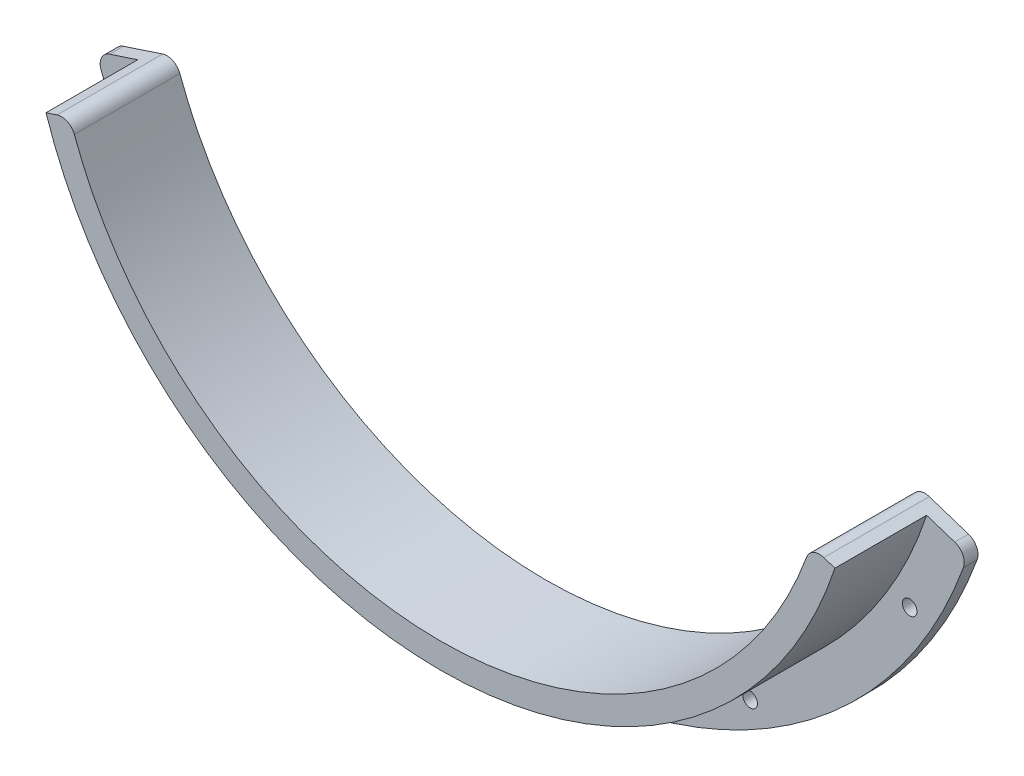
ISO-10303-21;
HEADER;
FILE_DESCRIPTION(('STEP AP214'),'2;1');
FILE_NAME('part.step','',(''),(''),'','','');
FILE_SCHEMA(('AUTOMOTIVE_DESIGN { 1 0 10303 214 1 1 1 1 }'));
ENDSEC;
DATA;
#1=APPLICATION_CONTEXT('core data for automotive mechanical design processes');
#2=APPLICATION_PROTOCOL_DEFINITION('international standard','automotive_design',2000,#1);
#3=PRODUCT_CONTEXT('',#1,'mechanical');
#4=PRODUCT('Part','Part','',(#3));
#5=PRODUCT_RELATED_PRODUCT_CATEGORY('part','',(#4));
#6=PRODUCT_DEFINITION_FORMATION('','',#4);
#7=PRODUCT_DEFINITION_CONTEXT('part definition',#1,'design');
#8=PRODUCT_DEFINITION('design','',#6,#7);
#9=PRODUCT_DEFINITION_SHAPE('','',#8);
#10=(LENGTH_UNIT() NAMED_UNIT(*) SI_UNIT(.MILLI.,.METRE.));
#11=(NAMED_UNIT(*) PLANE_ANGLE_UNIT() SI_UNIT($,.RADIAN.));
#12=(NAMED_UNIT(*) SI_UNIT($,.STERADIAN.) SOLID_ANGLE_UNIT());
#13=UNCERTAINTY_MEASURE_WITH_UNIT(LENGTH_MEASURE(1.E-05),#10,'distance_accuracy_value','');
#14=(GEOMETRIC_REPRESENTATION_CONTEXT(3) GLOBAL_UNCERTAINTY_ASSIGNED_CONTEXT((#13)) GLOBAL_UNIT_ASSIGNED_CONTEXT((#10,
#11,#12)) REPRESENTATION_CONTEXT('',''));
#15=CARTESIAN_POINT('',(0.,0.,0.));
#16=DIRECTION('',(0.,0.,1.));
#17=DIRECTION('',(1.,0.,0.));
#18=AXIS2_PLACEMENT_3D('',#15,#16,#17);
#19=CARTESIAN_POINT('',(0.,0.,3.));
#20=DIRECTION('',(0.,0.,-1.));
#21=DIRECTION('',(-1.,0.,0.));
#22=AXIS2_PLACEMENT_3D('',#19,#20,#21);
#23=CYLINDRICAL_SURFACE('',#22,85.);
#24=CARTESIAN_POINT('',(0.,0.,23.));
#25=DIRECTION('',(0.,0.,1.));
#26=DIRECTION('',(1.,0.,0.));
#27=AXIS2_PLACEMENT_3D('',#24,#25,#26);
#28=CIRCLE('',#27,85.);
#29=CARTESIAN_POINT('',(79.7982478830999,-29.278654934736,23.));
#30=VERTEX_POINT('',#29);
#31=CARTESIAN_POINT('',(-79.7982478830924,-29.2786549347566,23.));
#32=VERTEX_POINT('',#31);
#33=EDGE_CURVE('E142',#30,#32,#28,.F.);
#34=ORIENTED_EDGE('',*,*,#33,.F.);
#35=DIRECTION('',(0.,0.,-1.));
#36=VECTOR('',#35,1.);
#37=CARTESIAN_POINT('',(79.7982478830999,-29.278654934736,3.));
#38=LINE('',#37,#36);
#39=CARTESIAN_POINT('',(79.7982478830999,-29.278654934736,0.));
#40=VERTEX_POINT('',#39);
#41=EDGE_CURVE('E214',#30,#40,#38,.T.);
#42=ORIENTED_EDGE('',*,*,#41,.T.);
#43=CARTESIAN_POINT('',(0.,0.,0.));
#44=DIRECTION('',(0.,0.,1.));
#45=DIRECTION('',(1.,0.,0.));
#46=AXIS2_PLACEMENT_3D('',#43,#44,#45);
#47=CIRCLE('',#46,85.);
#48=CARTESIAN_POINT('',(-79.7982478830924,-29.2786549347566,0.));
#49=VERTEX_POINT('',#48);
#50=EDGE_CURVE('E137',#49,#40,#47,.T.);
#51=ORIENTED_EDGE('',*,*,#50,.F.);
#52=DIRECTION('',(0.,0.,-1.));
#53=VECTOR('',#52,1.);
#54=CARTESIAN_POINT('',(-79.7982478830924,-29.2786549347566,3.));
#55=LINE('',#54,#53);
#56=EDGE_CURVE('E59',#49,#32,#55,.F.);
#57=ORIENTED_EDGE('',*,*,#56,.T.);
#58=EDGE_LOOP('',(#34,#42,#51,#57));
#59=FACE_BOUND('',#58,.T.);
#60=ADVANCED_FACE('F36',(#59),#23,.F.);
#61=CARTESIAN_POINT('',(0.,0.,3.));
#62=DIRECTION('',(0.312249899920042,-0.94999999999996,0.));
#63=DIRECTION('',(0.94999999999996,0.312249899920042,0.));
#64=AXIS2_PLACEMENT_3D('',#61,#62,#63);
#65=PLANE('',#64);
#66=DIRECTION('',(-0.94999999999996,-0.312249899920042,0.));
#67=VECTOR('',#66,1.);
#68=CARTESIAN_POINT('',(0.,0.,23.));
#69=LINE('',#68,#67);
#70=CARTESIAN_POINT('',(-83.5514063316675,-27.4620192265716,23.));
#71=VERTEX_POINT('',#70);
#72=CARTESIAN_POINT('',(-85.9749999999964,-28.2586159427638,23.));
#73=VERTEX_POINT('',#72);
#74=EDGE_CURVE('E112',#71,#73,#69,.T.);
#75=ORIENTED_EDGE('',*,*,#74,.F.);
#76=DIRECTION('',(0.,0.,1.));
#77=VECTOR('',#76,1.);
#78=CARTESIAN_POINT('',(-83.5514063316675,-27.4620192265716,0.));
#79=LINE('',#78,#77);
#80=CARTESIAN_POINT('',(-83.5514063316675,-27.4620192265716,0.));
#81=VERTEX_POINT('',#80);
#82=EDGE_CURVE('E11',#71,#81,#79,.F.);
#83=ORIENTED_EDGE('',*,*,#82,.T.);
#84=DIRECTION('',(-0.94999999999996,-0.312249899920042,0.));
#85=VECTOR('',#84,1.);
#86=CARTESIAN_POINT('',(0.,0.,0.));
#87=LINE('',#86,#85);
#88=CARTESIAN_POINT('',(-92.1059172909063,-30.2737510064531,0.));
#89=VERTEX_POINT('',#88);
#90=EDGE_CURVE('E140',#81,#89,#87,.T.);
#91=ORIENTED_EDGE('',*,*,#90,.T.);
#92=DIRECTION('',(0.,0.,-1.));
#93=VECTOR('',#92,1.);
#94=CARTESIAN_POINT('',(-92.1059172909063,-30.2737510064531,3.));
#95=LINE('',#94,#93);
#96=CARTESIAN_POINT('',(-92.1059172909063,-30.2737510064531,3.));
#97=VERTEX_POINT('',#96);
#98=EDGE_CURVE('E44',#89,#97,#95,.F.);
#99=ORIENTED_EDGE('',*,*,#98,.T.);
#100=DIRECTION('',(-0.94999999999996,-0.312249899920042,0.));
#101=VECTOR('',#100,1.);
#102=CARTESIAN_POINT('',(0.,0.,3.));
#103=LINE('',#102,#101);
#104=CARTESIAN_POINT('',(-85.9749999999964,-28.2586159427638,3.));
#105=VERTEX_POINT('',#104);
#106=EDGE_CURVE('E136',#105,#97,#103,.T.);
#107=ORIENTED_EDGE('',*,*,#106,.F.);
#108=DIRECTION('',(0.,0.,-1.));
#109=VECTOR('',#108,1.);
#110=CARTESIAN_POINT('',(-85.9749999999964,-28.2586159427638,23.));
#111=LINE('',#110,#109);
#112=EDGE_CURVE('E127',#73,#105,#111,.T.);
#113=ORIENTED_EDGE('',*,*,#112,.F.);
#114=EDGE_LOOP('',(#75,#83,#91,#99,#107,#113));
#115=FACE_BOUND('',#114,.T.);
#116=ADVANCED_FACE('F134',(#115),#65,.F.);
#117=CARTESIAN_POINT('',(0.,0.,3.));
#118=DIRECTION('',(0.,0.,-1.));
#119=DIRECTION('',(-1.,0.,0.));
#120=AXIS2_PLACEMENT_3D('',#117,#118,#119);
#121=CYLINDRICAL_SURFACE('',#120,100.);
#122=CARTESIAN_POINT('',(0.,0.,0.));
#123=DIRECTION('',(0.,0.,1.));
#124=DIRECTION('',(1.,0.,0.));
#125=AXIS2_PLACEMENT_3D('',#122,#123,#124);
#126=CIRCLE('',#125,100.);
#127=CARTESIAN_POINT('',(-93.988832568192,-34.148196913869,0.));
#128=VERTEX_POINT('',#127);
#129=CARTESIAN_POINT('',(93.9888325682008,-34.1481969138448,0.));
#130=VERTEX_POINT('',#129);
#131=EDGE_CURVE('E172',#128,#130,#126,.T.);
#132=ORIENTED_EDGE('',*,*,#131,.T.);
#133=DIRECTION('',(0.,0.,-1.));
#134=VECTOR('',#133,1.);
#135=CARTESIAN_POINT('',(93.9888325682008,-34.1481969138448,3.));
#136=LINE('',#135,#134);
#137=CARTESIAN_POINT('',(93.9888325682008,-34.1481969138448,3.));
#138=VERTEX_POINT('',#137);
#139=EDGE_CURVE('E207',#130,#138,#136,.F.);
#140=ORIENTED_EDGE('',*,*,#139,.T.);
#141=CARTESIAN_POINT('',(0.,0.,3.));
#142=DIRECTION('',(0.,0.,1.));
#143=DIRECTION('',(1.,0.,0.));
#144=AXIS2_PLACEMENT_3D('',#141,#142,#143);
#145=CIRCLE('',#144,100.);
#146=CARTESIAN_POINT('',(-93.988832568192,-34.148196913869,3.));
#147=VERTEX_POINT('',#146);
#148=EDGE_CURVE('E147',#147,#138,#145,.T.);
#149=ORIENTED_EDGE('',*,*,#148,.F.);
#150=DIRECTION('',(0.,0.,-1.));
#151=VECTOR('',#150,1.);
#152=CARTESIAN_POINT('',(-93.988832568192,-34.148196913869,3.));
#153=LINE('',#152,#151);
#154=EDGE_CURVE('E204',#147,#128,#153,.T.);
#155=ORIENTED_EDGE('',*,*,#154,.T.);
#156=EDGE_LOOP('',(#132,#140,#149,#155));
#157=FACE_BOUND('',#156,.T.);
#158=ADVANCED_FACE('F230',(#157),#121,.T.);
#159=CARTESIAN_POINT('',(47.5000000000076,-82.2724133595197,3.));
#160=DIRECTION('',(0.,0.,-1.));
#161=DIRECTION('',(-1.,0.,0.));
#162=AXIS2_PLACEMENT_3D('',#159,#160,#161);
#163=CYLINDRICAL_SURFACE('',#162,1.60000000000717);
#164=CARTESIAN_POINT('',(47.5000000000076,-82.2724133595197,3.));
#165=DIRECTION('',(0.,0.,1.));
#166=DIRECTION('',(1.,0.,0.));
#167=AXIS2_PLACEMENT_3D('',#164,#165,#166);
#168=CIRCLE('',#167,1.60000000000717);
#169=CARTESIAN_POINT('',(49.1000000000147,-82.2724133595197,3.));
#170=VERTEX_POINT('',#169);
#171=EDGE_CURVE('E163',#170,#170,#168,.T.);
#172=ORIENTED_EDGE('',*,*,#171,.T.);
#173=EDGE_LOOP('',(#172));
#174=FACE_BOUND('',#173,.T.);
#175=CARTESIAN_POINT('',(47.5000000000076,-82.2724133595197,0.));
#176=DIRECTION('',(0.,0.,1.));
#177=DIRECTION('',(1.,0.,0.));
#178=AXIS2_PLACEMENT_3D('',#175,#176,#177);
#179=CIRCLE('',#178,1.60000000000717);
#180=CARTESIAN_POINT('',(49.1000000000147,-82.2724133595197,0.));
#181=VERTEX_POINT('',#180);
#182=EDGE_CURVE('E187',#181,#181,#179,.T.);
#183=ORIENTED_EDGE('',*,*,#182,.F.);
#184=EDGE_LOOP('',(#183));
#185=FACE_BOUND('',#184,.T.);
#186=ADVANCED_FACE('F283',(#174,#185),#163,.F.);
#187=CARTESIAN_POINT('',(8.06528475388945E-12,-95.,3.));
#188=DIRECTION('',(0.,0.,-1.));
#189=DIRECTION('',(-1.,0.,0.));
#190=AXIS2_PLACEMENT_3D('',#187,#188,#189);
#191=CYLINDRICAL_SURFACE('',#190,1.60000000000834);
#192=CARTESIAN_POINT('',(8.06528475388945E-12,-95.,3.));
#193=DIRECTION('',(0.,0.,1.));
#194=DIRECTION('',(1.,0.,0.));
#195=AXIS2_PLACEMENT_3D('',#192,#193,#194);
#196=CIRCLE('',#195,1.60000000000834);
#197=CARTESIAN_POINT('',(1.60000000001641,-95.,3.));
#198=VERTEX_POINT('',#197);
#199=EDGE_CURVE('E160',#198,#198,#196,.T.);
#200=ORIENTED_EDGE('',*,*,#199,.T.);
#201=EDGE_LOOP('',(#200));
#202=FACE_BOUND('',#201,.T.);
#203=CARTESIAN_POINT('',(8.06528475388945E-12,-95.,0.));
#204=DIRECTION('',(0.,0.,1.));
#205=DIRECTION('',(1.,0.,0.));
#206=AXIS2_PLACEMENT_3D('',#203,#204,#205);
#207=CIRCLE('',#206,1.60000000000834);
#208=CARTESIAN_POINT('',(1.60000000001641,-95.,0.));
#209=VERTEX_POINT('',#208);
#210=EDGE_CURVE('E184',#209,#209,#207,.T.);
#211=ORIENTED_EDGE('',*,*,#210,.F.);
#212=EDGE_LOOP('',(#211));
#213=FACE_BOUND('',#212,.T.);
#214=ADVANCED_FACE('F286',(#202,#213),#191,.F.);
#215=CARTESIAN_POINT('',(-47.4999999999925,-82.2724133595237,3.));
#216=DIRECTION('',(0.,0.,-1.));
#217=DIRECTION('',(-1.,0.,0.));
#218=AXIS2_PLACEMENT_3D('',#215,#216,#217);
#219=CYLINDRICAL_SURFACE('',#218,1.60000000000855);
#220=CARTESIAN_POINT('',(-47.4999999999925,-82.2724133595237,3.));
#221=DIRECTION('',(0.,0.,1.));
#222=DIRECTION('',(1.,0.,0.));
#223=AXIS2_PLACEMENT_3D('',#220,#221,#222);
#224=CIRCLE('',#223,1.60000000000855);
#225=CARTESIAN_POINT('',(-45.8999999999839,-82.2724133595237,3.));
#226=VERTEX_POINT('',#225);
#227=EDGE_CURVE('E157',#226,#226,#224,.T.);
#228=ORIENTED_EDGE('',*,*,#227,.T.);
#229=EDGE_LOOP('',(#228));
#230=FACE_BOUND('',#229,.T.);
#231=CARTESIAN_POINT('',(-47.4999999999925,-82.2724133595237,0.));
#232=DIRECTION('',(0.,0.,1.));
#233=DIRECTION('',(1.,0.,0.));
#234=AXIS2_PLACEMENT_3D('',#231,#232,#233);
#235=CIRCLE('',#234,1.60000000000855);
#236=CARTESIAN_POINT('',(-45.8999999999839,-82.2724133595237,0.));
#237=VERTEX_POINT('',#236);
#238=EDGE_CURVE('E181',#237,#237,#235,.T.);
#239=ORIENTED_EDGE('',*,*,#238,.F.);
#240=EDGE_LOOP('',(#239));
#241=FACE_BOUND('',#240,.T.);
#242=ADVANCED_FACE('F290',(#230,#241),#219,.F.);
#243=CARTESIAN_POINT('',(-82.2724133595156,-47.5000000000036,3.));
#244=DIRECTION('',(0.,0.,-1.));
#245=DIRECTION('',(-1.,0.,0.));
#246=AXIS2_PLACEMENT_3D('',#243,#244,#245);
#247=CYLINDRICAL_SURFACE('',#246,1.60000000000766);
#248=CARTESIAN_POINT('',(-82.2724133595156,-47.5000000000036,3.));
#249=DIRECTION('',(0.,0.,1.));
#250=DIRECTION('',(1.,0.,0.));
#251=AXIS2_PLACEMENT_3D('',#248,#249,#250);
#252=CIRCLE('',#251,1.60000000000766);
#253=CARTESIAN_POINT('',(-80.672413359508,-47.5000000000036,3.));
#254=VERTEX_POINT('',#253);
#255=EDGE_CURVE('E154',#254,#254,#252,.T.);
#256=ORIENTED_EDGE('',*,*,#255,.T.);
#257=EDGE_LOOP('',(#256));
#258=FACE_BOUND('',#257,.T.);
#259=CARTESIAN_POINT('',(-82.2724133595156,-47.5000000000036,0.));
#260=DIRECTION('',(0.,0.,1.));
#261=DIRECTION('',(1.,0.,0.));
#262=AXIS2_PLACEMENT_3D('',#259,#260,#261);
#263=CIRCLE('',#262,1.60000000000766);
#264=CARTESIAN_POINT('',(-80.672413359508,-47.5000000000036,0.));
#265=VERTEX_POINT('',#264);
#266=EDGE_CURVE('E178',#265,#265,#263,.T.);
#267=ORIENTED_EDGE('',*,*,#266,.F.);
#268=EDGE_LOOP('',(#267));
#269=FACE_BOUND('',#268,.T.);
#270=ADVANCED_FACE('F294',(#258,#269),#247,.F.);
#271=CARTESIAN_POINT('',(0.,0.,3.));
#272=DIRECTION('',(0.312249899919797,0.95000000000004,0.));
#273=DIRECTION('',(-0.95000000000004,0.312249899919797,0.));
#274=AXIS2_PLACEMENT_3D('',#271,#272,#273);
#275=PLANE('',#274);
#276=DIRECTION('',(0.95000000000004,-0.312249899919797,0.));
#277=VECTOR('',#276,1.);
#278=CARTESIAN_POINT('',(0.,0.,3.));
#279=LINE('',#278,#277);
#280=CARTESIAN_POINT('',(85.9750000000036,-28.2586159427417,3.));
#281=VERTEX_POINT('',#280);
#282=CARTESIAN_POINT('',(92.1059172909142,-30.2737510064293,3.));
#283=VERTEX_POINT('',#282);
#284=EDGE_CURVE('E151',#281,#283,#279,.T.);
#285=ORIENTED_EDGE('',*,*,#284,.T.);
#286=DIRECTION('',(0.,0.,1.));
#287=VECTOR('',#286,1.);
#288=CARTESIAN_POINT('',(92.1059172909141,-30.2737510064293,0.));
#289=LINE('',#288,#287);
#290=CARTESIAN_POINT('',(92.1059172909142,-30.2737510064293,0.));
#291=VERTEX_POINT('',#290);
#292=EDGE_CURVE('E193',#283,#291,#289,.F.);
#293=ORIENTED_EDGE('',*,*,#292,.T.);
#294=DIRECTION('',(0.95000000000004,-0.312249899919797,0.));
#295=VECTOR('',#294,1.);
#296=CARTESIAN_POINT('',(0.,0.,0.));
#297=LINE('',#296,#295);
#298=CARTESIAN_POINT('',(83.5514063316746,-27.4620192265501,0.));
#299=VERTEX_POINT('',#298);
#300=EDGE_CURVE('E175',#299,#291,#297,.T.);
#301=ORIENTED_EDGE('',*,*,#300,.F.);
#302=DIRECTION('',(0.,0.,-1.));
#303=VECTOR('',#302,1.);
#304=CARTESIAN_POINT('',(83.5514063316746,-27.4620192265501,3.));
#305=LINE('',#304,#303);
#306=CARTESIAN_POINT('',(83.5514063316746,-27.4620192265501,23.));
#307=VERTEX_POINT('',#306);
#308=EDGE_CURVE('E168',#299,#307,#305,.F.);
#309=ORIENTED_EDGE('',*,*,#308,.T.);
#310=DIRECTION('',(-0.95000000000004,0.312249899919797,0.));
#311=VECTOR('',#310,1.);
#312=CARTESIAN_POINT('',(0.,0.,23.));
#313=LINE('',#312,#311);
#314=CARTESIAN_POINT('',(85.9750000000036,-28.2586159427417,23.));
#315=VERTEX_POINT('',#314);
#316=EDGE_CURVE('E131',#315,#307,#313,.T.);
#317=ORIENTED_EDGE('',*,*,#316,.F.);
#318=DIRECTION('',(0.,0.,-1.));
#319=VECTOR('',#318,1.);
#320=CARTESIAN_POINT('',(85.9750000000036,-28.2586159427417,23.));
#321=LINE('',#320,#319);
#322=EDGE_CURVE('E129',#315,#281,#321,.T.);
#323=ORIENTED_EDGE('',*,*,#322,.T.);
#324=EDGE_LOOP('',(#285,#293,#301,#309,#317,#323));
#325=FACE_BOUND('',#324,.T.);
#326=ADVANCED_FACE('F241',(#325),#275,.T.);
#327=CARTESIAN_POINT('',(82.2724133595277,-47.4999999999965,3.));
#328=DIRECTION('',(0.,0.,-1.));
#329=DIRECTION('',(-1.,0.,0.));
#330=AXIS2_PLACEMENT_3D('',#327,#328,#329);
#331=CYLINDRICAL_SURFACE('',#330,1.6000000000052);
#332=CARTESIAN_POINT('',(82.2724133595277,-47.4999999999965,3.));
#333=DIRECTION('',(0.,0.,1.));
#334=DIRECTION('',(1.,0.,0.));
#335=AXIS2_PLACEMENT_3D('',#332,#333,#334);
#336=CIRCLE('',#335,1.6000000000052);
#337=CARTESIAN_POINT('',(83.872413359533,-47.4999999999965,3.));
#338=VERTEX_POINT('',#337);
#339=EDGE_CURVE('E166',#338,#338,#336,.T.);
#340=ORIENTED_EDGE('',*,*,#339,.T.);
#341=EDGE_LOOP('',(#340));
#342=FACE_BOUND('',#341,.T.);
#343=CARTESIAN_POINT('',(82.2724133595277,-47.4999999999965,0.));
#344=DIRECTION('',(0.,0.,1.));
#345=DIRECTION('',(1.,0.,0.));
#346=AXIS2_PLACEMENT_3D('',#343,#344,#345);
#347=CIRCLE('',#346,1.6000000000052);
#348=CARTESIAN_POINT('',(83.872413359533,-47.4999999999965,0.));
#349=VERTEX_POINT('',#348);
#350=EDGE_CURVE('E148',#349,#349,#347,.T.);
#351=ORIENTED_EDGE('',*,*,#350,.F.);
#352=EDGE_LOOP('',(#351));
#353=FACE_BOUND('',#352,.T.);
#354=ADVANCED_FACE('F277',(#342,#353),#331,.F.);
#355=CARTESIAN_POINT('',(0.,0.,3.));
#356=DIRECTION('',(0.,0.,1.));
#357=DIRECTION('',(1.,0.,0.));
#358=AXIS2_PLACEMENT_3D('',#355,#356,#357);
#359=PLANE('',#358);
#360=ORIENTED_EDGE('',*,*,#148,.T.);
#361=CARTESIAN_POINT('',(91.1691675911547,-33.1237510064294,3.));
#362=DIRECTION('',(0.,0.,1.));
#363=DIRECTION('',(1.,0.,0.));
#364=AXIS2_PLACEMENT_3D('',#361,#362,#363);
#365=CIRCLE('',#364,3.);
#366=EDGE_CURVE('E211',#138,#283,#365,.T.);
#367=ORIENTED_EDGE('',*,*,#366,.T.);
#368=ORIENTED_EDGE('',*,*,#284,.F.);
#369=CARTESIAN_POINT('',(0.,0.,3.));
#370=DIRECTION('',(0.,0.,1.));
#371=DIRECTION('',(1.,0.,0.));
#372=AXIS2_PLACEMENT_3D('',#369,#370,#371);
#373=CIRCLE('',#372,90.5);
#374=EDGE_CURVE('E121',#105,#281,#373,.T.);
#375=ORIENTED_EDGE('',*,*,#374,.F.);
#376=ORIENTED_EDGE('',*,*,#106,.T.);
#377=CARTESIAN_POINT('',(-91.1691675911462,-33.1237510064529,3.));
#378=DIRECTION('',(0.,0.,1.));
#379=DIRECTION('',(1.,0.,0.));
#380=AXIS2_PLACEMENT_3D('',#377,#378,#379);
#381=CIRCLE('',#380,3.);
#382=EDGE_CURVE('E209',#97,#147,#381,.T.);
#383=ORIENTED_EDGE('',*,*,#382,.T.);
#384=EDGE_LOOP('',(#360,#367,#368,#375,#376,#383));
#385=FACE_BOUND('',#384,.T.);
#386=ORIENTED_EDGE('',*,*,#255,.F.);
#387=EDGE_LOOP('',(#386));
#388=FACE_BOUND('',#387,.T.);
#389=ORIENTED_EDGE('',*,*,#227,.F.);
#390=EDGE_LOOP('',(#389));
#391=FACE_BOUND('',#390,.T.);
#392=ORIENTED_EDGE('',*,*,#199,.F.);
#393=EDGE_LOOP('',(#392));
#394=FACE_BOUND('',#393,.T.);
#395=ORIENTED_EDGE('',*,*,#171,.F.);
#396=EDGE_LOOP('',(#395));
#397=FACE_BOUND('',#396,.T.);
#398=ORIENTED_EDGE('',*,*,#339,.F.);
#399=EDGE_LOOP('',(#398));
#400=FACE_BOUND('',#399,.T.);
#401=ADVANCED_FACE('F224',(#385,#388,#391,#394,#397,#400),#359,.T.);
#402=CARTESIAN_POINT('',(0.,0.,0.));
#403=DIRECTION('',(0.,0.,1.));
#404=DIRECTION('',(1.,0.,0.));
#405=AXIS2_PLACEMENT_3D('',#402,#403,#404);
#406=PLANE('',#405);
#407=ORIENTED_EDGE('',*,*,#300,.T.);
#408=CARTESIAN_POINT('',(91.1691675911547,-33.1237510064294,0.));
#409=DIRECTION('',(0.,0.,1.));
#410=DIRECTION('',(1.,0.,0.));
#411=AXIS2_PLACEMENT_3D('',#408,#409,#410);
#412=CIRCLE('',#411,3.);
#413=EDGE_CURVE('E202',#291,#130,#412,.F.);
#414=ORIENTED_EDGE('',*,*,#413,.T.);
#415=ORIENTED_EDGE('',*,*,#131,.F.);
#416=CARTESIAN_POINT('',(-91.1691675911462,-33.1237510064529,0.));
#417=DIRECTION('',(0.,0.,1.));
#418=DIRECTION('',(1.,0.,0.));
#419=AXIS2_PLACEMENT_3D('',#416,#417,#418);
#420=CIRCLE('',#419,3.);
#421=EDGE_CURVE('E196',#128,#89,#420,.F.);
#422=ORIENTED_EDGE('',*,*,#421,.T.);
#423=ORIENTED_EDGE('',*,*,#90,.F.);
#424=CARTESIAN_POINT('',(-82.6146566319074,-30.3120192265715,0.));
#425=DIRECTION('',(0.,0.,1.));
#426=DIRECTION('',(1.,0.,0.));
#427=AXIS2_PLACEMENT_3D('',#424,#425,#426);
#428=CIRCLE('',#427,3.);
#429=EDGE_CURVE('E198',#81,#49,#428,.F.);
#430=ORIENTED_EDGE('',*,*,#429,.T.);
#431=ORIENTED_EDGE('',*,*,#50,.T.);
#432=CARTESIAN_POINT('',(82.6146566319152,-30.3120192265502,0.));
#433=DIRECTION('',(0.,0.,1.));
#434=DIRECTION('',(1.,0.,0.));
#435=AXIS2_PLACEMENT_3D('',#432,#433,#434);
#436=CIRCLE('',#435,3.);
#437=EDGE_CURVE('E200',#40,#299,#436,.F.);
#438=ORIENTED_EDGE('',*,*,#437,.T.);
#439=EDGE_LOOP('',(#407,#414,#415,#422,#423,#430,#431,#438));
#440=FACE_BOUND('',#439,.T.);
#441=ORIENTED_EDGE('',*,*,#266,.T.);
#442=EDGE_LOOP('',(#441));
#443=FACE_BOUND('',#442,.T.);
#444=ORIENTED_EDGE('',*,*,#238,.T.);
#445=EDGE_LOOP('',(#444));
#446=FACE_BOUND('',#445,.T.);
#447=ORIENTED_EDGE('',*,*,#210,.T.);
#448=EDGE_LOOP('',(#447));
#449=FACE_BOUND('',#448,.T.);
#450=ORIENTED_EDGE('',*,*,#182,.T.);
#451=EDGE_LOOP('',(#450));
#452=FACE_BOUND('',#451,.T.);
#453=ORIENTED_EDGE('',*,*,#350,.T.);
#454=EDGE_LOOP('',(#453));
#455=FACE_BOUND('',#454,.T.);
#456=ADVANCED_FACE('F233',(#440,#443,#446,#449,#452,#455),#406,.F.);
#457=CARTESIAN_POINT('',(0.,0.,23.));
#458=DIRECTION('',(0.,0.,-1.));
#459=DIRECTION('',(-1.,0.,0.));
#460=AXIS2_PLACEMENT_3D('',#457,#458,#459);
#461=CYLINDRICAL_SURFACE('',#460,90.5);
#462=ORIENTED_EDGE('',*,*,#374,.T.);
#463=ORIENTED_EDGE('',*,*,#322,.F.);
#464=CARTESIAN_POINT('',(0.,0.,23.));
#465=DIRECTION('',(0.,0.,1.));
#466=DIRECTION('',(1.,0.,0.));
#467=AXIS2_PLACEMENT_3D('',#464,#465,#466);
#468=CIRCLE('',#467,90.5);
#469=EDGE_CURVE('E116',#73,#315,#468,.T.);
#470=ORIENTED_EDGE('',*,*,#469,.F.);
#471=ORIENTED_EDGE('',*,*,#112,.T.);
#472=EDGE_LOOP('',(#462,#463,#470,#471));
#473=FACE_BOUND('',#472,.T.);
#474=ADVANCED_FACE('F126',(#473),#461,.T.);
#475=CARTESIAN_POINT('',(0.,0.,23.));
#476=DIRECTION('',(0.,0.,1.));
#477=DIRECTION('',(1.,0.,0.));
#478=AXIS2_PLACEMENT_3D('',#475,#476,#477);
#479=PLANE('',#478);
#480=ORIENTED_EDGE('',*,*,#316,.T.);
#481=CARTESIAN_POINT('',(82.6146566319152,-30.3120192265502,23.));
#482=DIRECTION('',(0.,0.,1.));
#483=DIRECTION('',(1.,0.,0.));
#484=AXIS2_PLACEMENT_3D('',#481,#482,#483);
#485=CIRCLE('',#484,3.);
#486=EDGE_CURVE('E218',#307,#30,#485,.T.);
#487=ORIENTED_EDGE('',*,*,#486,.T.);
#488=ORIENTED_EDGE('',*,*,#33,.T.);
#489=CARTESIAN_POINT('',(-82.6146566319074,-30.3120192265715,23.));
#490=DIRECTION('',(0.,0.,1.));
#491=DIRECTION('',(1.,0.,0.));
#492=AXIS2_PLACEMENT_3D('',#489,#490,#491);
#493=CIRCLE('',#492,3.);
#494=EDGE_CURVE('E51',#32,#71,#493,.T.);
#495=ORIENTED_EDGE('',*,*,#494,.T.);
#496=ORIENTED_EDGE('',*,*,#74,.T.);
#497=ORIENTED_EDGE('',*,*,#469,.T.);
#498=EDGE_LOOP('',(#480,#487,#488,#495,#496,#497));
#499=FACE_BOUND('',#498,.T.);
#500=ADVANCED_FACE('F115',(#499),#479,.T.);
#501=CARTESIAN_POINT('',(91.1691675911547,-33.1237510064294,3.));
#502=DIRECTION('',(0.,0.,-1.));
#503=DIRECTION('',(-1.,0.,0.));
#504=AXIS2_PLACEMENT_3D('',#501,#502,#503);
#505=CYLINDRICAL_SURFACE('',#504,3.);
#506=ORIENTED_EDGE('',*,*,#366,.F.);
#507=ORIENTED_EDGE('',*,*,#139,.F.);
#508=ORIENTED_EDGE('',*,*,#413,.F.);
#509=ORIENTED_EDGE('',*,*,#292,.F.);
#510=EDGE_LOOP('',(#506,#507,#508,#509));
#511=FACE_BOUND('',#510,.T.);
#512=ADVANCED_FACE('F239',(#511),#505,.T.);
#513=CARTESIAN_POINT('',(82.6146566319152,-30.3120192265502,3.));
#514=DIRECTION('',(0.,0.,-1.));
#515=DIRECTION('',(-1.,0.,0.));
#516=AXIS2_PLACEMENT_3D('',#513,#514,#515);
#517=CYLINDRICAL_SURFACE('',#516,3.);
#518=ORIENTED_EDGE('',*,*,#486,.F.);
#519=ORIENTED_EDGE('',*,*,#308,.F.);
#520=ORIENTED_EDGE('',*,*,#437,.F.);
#521=ORIENTED_EDGE('',*,*,#41,.F.);
#522=EDGE_LOOP('',(#518,#519,#520,#521));
#523=FACE_BOUND('',#522,.T.);
#524=ADVANCED_FACE('F248',(#523),#517,.T.);
#525=CARTESIAN_POINT('',(-82.6146566319074,-30.3120192265715,3.));
#526=DIRECTION('',(0.,0.,-1.));
#527=DIRECTION('',(-1.,0.,0.));
#528=AXIS2_PLACEMENT_3D('',#525,#526,#527);
#529=CYLINDRICAL_SURFACE('',#528,3.);
#530=ORIENTED_EDGE('',*,*,#494,.F.);
#531=ORIENTED_EDGE('',*,*,#56,.F.);
#532=ORIENTED_EDGE('',*,*,#429,.F.);
#533=ORIENTED_EDGE('',*,*,#82,.F.);
#534=EDGE_LOOP('',(#530,#531,#532,#533));
#535=FACE_BOUND('',#534,.T.);
#536=ADVANCED_FACE('F250',(#535),#529,.T.);
#537=CARTESIAN_POINT('',(-91.1691675911462,-33.1237510064529,3.));
#538=DIRECTION('',(0.,0.,-1.));
#539=DIRECTION('',(-1.,0.,0.));
#540=AXIS2_PLACEMENT_3D('',#537,#538,#539);
#541=CYLINDRICAL_SURFACE('',#540,3.);
#542=ORIENTED_EDGE('',*,*,#382,.F.);
#543=ORIENTED_EDGE('',*,*,#98,.F.);
#544=ORIENTED_EDGE('',*,*,#421,.F.);
#545=ORIENTED_EDGE('',*,*,#154,.F.);
#546=EDGE_LOOP('',(#542,#543,#544,#545));
#547=FACE_BOUND('',#546,.T.);
#548=ADVANCED_FACE('F38',(#547),#541,.T.);
#549=CLOSED_SHELL('',(#60,#116,#158,#186,#214,#242,#270,#326,#354,#401,#456,#474,#500,#512,#524,
#536,#548));
#550=MANIFOLD_SOLID_BREP('B2',#549);
#551=ADVANCED_BREP_SHAPE_REPRESENTATION('',(#18,#550),#14);
#552=SHAPE_DEFINITION_REPRESENTATION(#9,#551);
ENDSEC;
END-ISO-10303-21;
